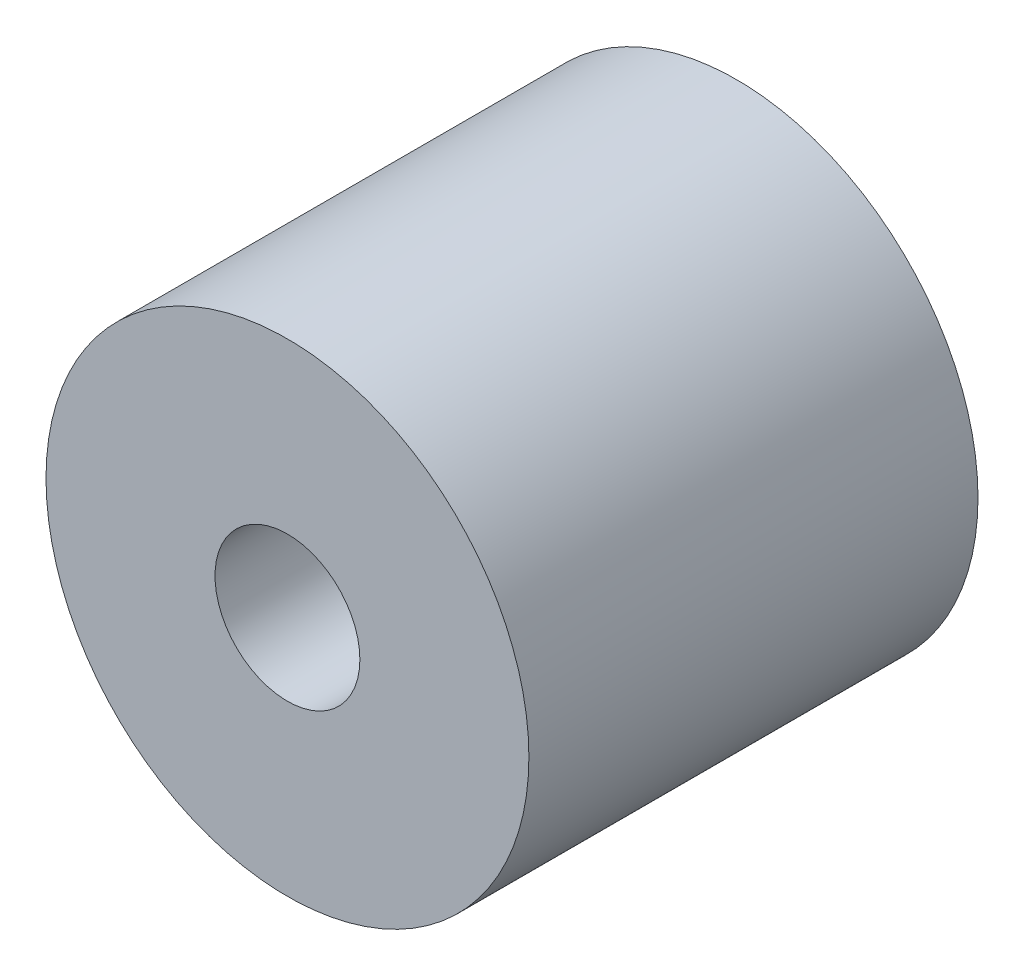
ISO-10303-21;
HEADER;
FILE_DESCRIPTION(('STEP AP214'),'2;1');
FILE_NAME('part.step','',(''),(''),'','','');
FILE_SCHEMA(('AUTOMOTIVE_DESIGN { 1 0 10303 214 1 1 1 1 }'));
ENDSEC;
DATA;
#1=APPLICATION_CONTEXT('core data for automotive mechanical design processes');
#2=APPLICATION_PROTOCOL_DEFINITION('international standard','automotive_design',2000,#1);
#3=PRODUCT_CONTEXT('',#1,'mechanical');
#4=PRODUCT('Part','Part','',(#3));
#5=PRODUCT_RELATED_PRODUCT_CATEGORY('part','',(#4));
#6=PRODUCT_DEFINITION_FORMATION('','',#4);
#7=PRODUCT_DEFINITION_CONTEXT('part definition',#1,'design');
#8=PRODUCT_DEFINITION('design','',#6,#7);
#9=PRODUCT_DEFINITION_SHAPE('','',#8);
#10=(LENGTH_UNIT() NAMED_UNIT(*) SI_UNIT(.MILLI.,.METRE.));
#11=(NAMED_UNIT(*) PLANE_ANGLE_UNIT() SI_UNIT($,.RADIAN.));
#12=(NAMED_UNIT(*) SI_UNIT($,.STERADIAN.) SOLID_ANGLE_UNIT());
#13=UNCERTAINTY_MEASURE_WITH_UNIT(LENGTH_MEASURE(1.E-05),#10,'distance_accuracy_value','');
#14=(GEOMETRIC_REPRESENTATION_CONTEXT(3) GLOBAL_UNCERTAINTY_ASSIGNED_CONTEXT((#13)) GLOBAL_UNIT_ASSIGNED_CONTEXT((#10,
#11,#12)) REPRESENTATION_CONTEXT('',''));
#15=CARTESIAN_POINT('',(0.,0.,0.));
#16=DIRECTION('',(0.,0.,1.));
#17=DIRECTION('',(1.,0.,0.));
#18=AXIS2_PLACEMENT_3D('',#15,#16,#17);
#19=CARTESIAN_POINT('',(0.,0.,9.3));
#20=DIRECTION('',(0.,0.,-1.));
#21=DIRECTION('',(-1.,0.,0.));
#22=AXIS2_PLACEMENT_3D('',#19,#20,#21);
#23=CYLINDRICAL_SURFACE('',#22,5.);
#24=CARTESIAN_POINT('',(0.,-5.,2.5));
#25=CARTESIAN_POINT('',(0.0280101768957786,-4.99999967760385,2.49999878704981));
#26=CARTESIAN_POINT('',(0.0560388725838865,-4.99976212798103,2.49763836555178));
#27=CARTESIAN_POINT('',(0.111319199248419,-4.99883733797369,2.48825781485479));
#28=CARTESIAN_POINT('',(0.138569939584414,-4.99814960217013,2.48123255198771));
#29=CARTESIAN_POINT('',(0.191485837726708,-4.99640207281535,2.46272887970108));
#30=CARTESIAN_POINT('',(0.217151942307455,-4.99534250400354,2.45125315974076));
#31=CARTESIAN_POINT('',(0.266188080480204,-4.99296978697153,2.42417954603418));
#32=CARTESIAN_POINT('',(0.289558569389539,-4.99165668919066,2.40858247199993));
#33=CARTESIAN_POINT('',(0.333429775337041,-4.98891872170662,2.37364865116886));
#34=CARTESIAN_POINT('',(0.353921072417446,-4.98749350786933,2.35430010029898));
#35=CARTESIAN_POINT('',(0.391371260715492,-4.98469478453131,2.31243773286849));
#36=CARTESIAN_POINT('',(0.408329988541327,-4.98332127742458,2.28992376997881));
#37=CARTESIAN_POINT('',(0.438266985221809,-4.98077795776392,2.24231073415819));
#38=CARTESIAN_POINT('',(0.45123673272744,-4.97960858355452,2.21720627795257));
#39=CARTESIAN_POINT('',(0.47277319237138,-4.97761018773262,2.16516220704751));
#40=CARTESIAN_POINT('',(0.481340013295646,-4.97678115771111,2.13822263770803));
#41=CARTESIAN_POINT('',(0.493799520800947,-4.97556042036489,2.08336909956699));
#42=CARTESIAN_POINT('',(0.497707826501898,-4.97516725199048,2.0554587115739));
#43=CARTESIAN_POINT('',(0.50078764256768,-4.97485821530263,1.99937556830211));
#44=CARTESIAN_POINT('',(0.499959277435401,-4.97494233444373,1.97120281993897));
#45=CARTESIAN_POINT('',(0.493602140126339,-4.97557703449467,1.91550234515334));
#46=CARTESIAN_POINT('',(0.488090422062276,-4.97612592295325,1.88797265033565));
#47=CARTESIAN_POINT('',(0.472549572075293,-4.97762567143709,1.83423101839945));
#48=CARTESIAN_POINT('',(0.462520379127873,-4.97857653689246,1.80801909908748));
#49=CARTESIAN_POINT('',(0.438210446940754,-4.98077504726035,1.75760320635056));
#50=CARTESIAN_POINT('',(0.42392214135999,-4.98202321954079,1.73340290525534));
#51=CARTESIAN_POINT('',(0.391505013676614,-4.98467525866439,1.68773739254406));
#52=CARTESIAN_POINT('',(0.373376079168253,-4.98607913006392,1.66627226100912));
#53=CARTESIAN_POINT('',(0.333697056206035,-4.98889192656495,1.62658730300549));
#54=CARTESIAN_POINT('',(0.312132239425682,-4.99030084666499,1.6083821990596));
#55=CARTESIAN_POINT('',(0.266244740868556,-4.99295914539259,1.57584818354481));
#56=CARTESIAN_POINT('',(0.2419220559998,-4.99420852384128,1.56151927632176));
#57=CARTESIAN_POINT('',(0.191199052846182,-4.99640737833548,1.53714498984487));
#58=CARTESIAN_POINT('',(0.164798373194951,-4.99735680207385,1.52710035759097));
#59=CARTESIAN_POINT('',(0.110673608664966,-4.99884823720704,1.51159054164412));
#60=CARTESIAN_POINT('',(0.0829495633883001,-4.99939026078532,1.50612522100469));
#61=CARTESIAN_POINT('',(0.0270925495459519,-5.00000425834155,1.49994784613262));
#62=CARTESIAN_POINT('',(-0.00103815105274598,-5.00007824133868,1.49921547587375));
#63=CARTESIAN_POINT('',(-0.0570218966578499,-4.99975320878398,1.50247143152438));
#64=CARTESIAN_POINT('',(-0.084874945410235,-4.99935419962234,1.50645969365764));
#65=CARTESIAN_POINT('',(-0.139454103417338,-4.99812930769597,1.51902684771079));
#66=CARTESIAN_POINT('',(-0.16618242448601,-4.9973043095902,1.52759622723901));
#67=CARTESIAN_POINT('',(-0.217822160691891,-4.99531999430305,1.54907258701864));
#68=CARTESIAN_POINT('',(-0.242733535078559,-4.99416066962627,1.5619796645197));
#69=CARTESIAN_POINT('',(-0.290124090086071,-4.99163237665211,1.59181541933196));
#70=CARTESIAN_POINT('',(-0.312594829874459,-4.9902627180172,1.60875744446291));
#71=CARTESIAN_POINT('',(-0.354380811655939,-4.9874696643476,1.64616303387046));
#72=CARTESIAN_POINT('',(-0.373695974424589,-4.98604626796486,1.66662668653516));
#73=CARTESIAN_POINT('',(-0.408693054943573,-4.98330012070377,1.7105832873295));
#74=CARTESIAN_POINT('',(-0.424361639339772,-4.98197775069488,1.73408687827131));
#75=CARTESIAN_POINT('',(-0.451529129371914,-4.97958916230445,1.78340368007334));
#76=CARTESIAN_POINT('',(-0.463028092026941,-4.97852294042019,1.8092168593442));
#77=CARTESIAN_POINT('',(-0.481507604342238,-4.97676973817025,1.8623743697329));
#78=CARTESIAN_POINT('',(-0.488496087405931,-4.97608209224894,1.88971592004556));
#79=CARTESIAN_POINT('',(-0.497782003564732,-4.97516182641438,1.94519159898039));
#80=CARTESIAN_POINT('',(-0.500079571199759,-4.97492919345093,1.97332570484784));
#81=CARTESIAN_POINT('',(-0.499916569235628,-4.97494556553781,2.02945534417835));
#82=CARTESIAN_POINT('',(-0.497476944796556,-4.97519245043504,2.05745094144141));
#83=CARTESIAN_POINT('',(-0.487952726481827,-4.97613551944773,2.11263245858414));
#84=CARTESIAN_POINT('',(-0.48086812738108,-4.97683170406859,2.13981837755299));
#85=CARTESIAN_POINT('',(-0.462260843148752,-4.97859434131593,2.19260867452393));
#86=CARTESIAN_POINT('',(-0.450738772170458,-4.9796607427018,2.21821327081486));
#87=CARTESIAN_POINT('',(-0.423585777455522,-4.98204375919679,2.26712844583552));
#88=CARTESIAN_POINT('',(-0.407954876727707,-4.98336037290475,2.29043903741032));
#89=CARTESIAN_POINT('',(-0.372949278142666,-4.98610243604849,2.33421183723597));
#90=CARTESIAN_POINT('',(-0.353558974445134,-4.98752832363375,2.35466153818354));
#91=CARTESIAN_POINT('',(-0.311615849612555,-4.99032427364391,2.39202611634983));
#92=CARTESIAN_POINT('',(-0.289062272054128,-4.99169432261488,2.40894014567859));
#93=CARTESIAN_POINT('',(-0.241370717080645,-4.99422781034581,2.43878672692731));
#94=CARTESIAN_POINT('',(-0.216226374673382,-4.99539072013406,2.45170914547259));
#95=CARTESIAN_POINT('',(-0.164129139550275,-4.99737314624948,2.47313121141193));
#96=CARTESIAN_POINT('',(-0.137178324912805,-4.99819304954827,2.48163584547677));
#97=CARTESIAN_POINT('',(-0.0917291307028519,-4.99919106886867,2.4918603085424));
#98=CARTESIAN_POINT('',(-0.0735212764222541,-4.99949300345916,2.49490852214968));
#99=CARTESIAN_POINT('',(-0.0368782904086562,-4.99989757475393,2.49897876303088));
#100=CARTESIAN_POINT('',(-0.0184431596132788,-5.00000021228012,2.50000079866093));
#101=CARTESIAN_POINT('',(0.,-5.,2.5));
#102=B_SPLINE_CURVE_WITH_KNOTS('',3,(#24,#25,#26,#27,#28,#29,#30,#31,#32,#33,#34,#35,#36,#37,
#38,#39,#40,#41,#42,#43,#44,#45,#46,#47,#48,#49,#50,#51,#52,#53,#54,#55,#56,#57,#58,#59,#60,#61,
#62,#63,#64,#65,#66,#67,#68,#69,#70,#71,#72,#73,#74,#75,#76,#77,#78,#79,#80,#81,#82,#83,#84,#85,
#86,#87,#88,#89,#90,#91,#92,#93,#94,#95,#96,#97,#98,#99,#100,#101),.UNSPECIFIED.,.T.,.F.,(4,2,2,
2,2,2,2,2,2,2,2,2,2,2,2,2,2,2,2,2,2,2,2,2,2,2,2,2,2,2,2,2,2,2,2,2,2,2,4),(0.,0.083963183134237,
0.168018921417743,0.252023942866102,0.336012268791392,0.420269284311473,0.504530196103529,
0.588969877361109,0.67340747221252,0.757561160225983,0.841712636278883,0.925558987205553,
1.00940647080817,1.09340380686447,1.17740360165563,1.26177367098103,1.34614383489886,
1.43052870346791,1.5149110483772,1.59893094303879,1.68294970259572,1.76679467647152,
1.85064153024734,1.93476970374349,2.01889998905115,2.10333321804299,2.18776529237687,
2.27204845296502,2.35632919619793,2.44023814646978,2.5241471911302,2.608044626814,
2.6919415926948,2.77619458713827,2.86046776318479,2.94495315513121,3.02934297397648,
3.08462833616174,3.13991347034514),.UNSPECIFIED.);
#103=CARTESIAN_POINT('',(0.,-5.,2.5));
#104=VERTEX_POINT('',#103);
#105=EDGE_CURVE('E69',#104,#104,#102,.T.);
#106=ORIENTED_EDGE('',*,*,#105,.T.);
#107=EDGE_LOOP('',(#106));
#108=FACE_BOUND('',#107,.T.);
#109=CARTESIAN_POINT('',(0.,0.,9.3));
#110=DIRECTION('',(0.,0.,1.));
#111=DIRECTION('',(1.,0.,0.));
#112=AXIS2_PLACEMENT_3D('',#109,#110,#111);
#113=CIRCLE('',#112,5.);
#114=CARTESIAN_POINT('',(5.,0.,9.3));
#115=VERTEX_POINT('',#114);
#116=EDGE_CURVE('E11',#115,#115,#113,.T.);
#117=ORIENTED_EDGE('',*,*,#116,.F.);
#118=EDGE_LOOP('',(#117));
#119=FACE_BOUND('',#118,.T.);
#120=CARTESIAN_POINT('',(0.,0.,0.));
#121=DIRECTION('',(0.,0.,1.));
#122=DIRECTION('',(1.,0.,0.));
#123=AXIS2_PLACEMENT_3D('',#120,#121,#122);
#124=CIRCLE('',#123,5.);
#125=CARTESIAN_POINT('',(5.,0.,0.));
#126=VERTEX_POINT('',#125);
#127=EDGE_CURVE('E53',#126,#126,#124,.T.);
#128=ORIENTED_EDGE('',*,*,#127,.T.);
#129=EDGE_LOOP('',(#128));
#130=FACE_BOUND('',#129,.T.);
#131=ADVANCED_FACE('F39',(#108,#119,#130),#23,.T.);
#132=CARTESIAN_POINT('',(0.,0.,9.3));
#133=DIRECTION('',(0.,0.,1.));
#134=DIRECTION('',(1.,0.,0.));
#135=AXIS2_PLACEMENT_3D('',#132,#133,#134);
#136=PLANE('',#135);
#137=CARTESIAN_POINT('',(0.,0.,9.3));
#138=DIRECTION('',(0.,0.,1.));
#139=DIRECTION('',(1.,0.,0.));
#140=AXIS2_PLACEMENT_3D('',#137,#138,#139);
#141=CIRCLE('',#140,1.5);
#142=CARTESIAN_POINT('',(1.5,0.,9.3));
#143=VERTEX_POINT('',#142);
#144=EDGE_CURVE('E84',#143,#143,#141,.T.);
#145=ORIENTED_EDGE('',*,*,#144,.F.);
#146=EDGE_LOOP('',(#145));
#147=FACE_BOUND('',#146,.T.);
#148=ORIENTED_EDGE('',*,*,#116,.T.);
#149=EDGE_LOOP('',(#148));
#150=FACE_BOUND('',#149,.T.);
#151=ADVANCED_FACE('F108',(#147,#150),#136,.T.);
#152=CARTESIAN_POINT('',(0.,0.,0.));
#153=DIRECTION('',(0.,0.,1.));
#154=DIRECTION('',(1.,0.,0.));
#155=AXIS2_PLACEMENT_3D('',#152,#153,#154);
#156=PLANE('',#155);
#157=CARTESIAN_POINT('',(0.,0.,0.));
#158=DIRECTION('',(0.,0.,1.));
#159=DIRECTION('',(1.,0.,0.));
#160=AXIS2_PLACEMENT_3D('',#157,#158,#159);
#161=CIRCLE('',#160,1.5);
#162=CARTESIAN_POINT('',(1.5,0.,0.));
#163=VERTEX_POINT('',#162);
#164=EDGE_CURVE('E74',#163,#163,#161,.T.);
#165=ORIENTED_EDGE('',*,*,#164,.T.);
#166=EDGE_LOOP('',(#165));
#167=FACE_BOUND('',#166,.T.);
#168=ORIENTED_EDGE('',*,*,#127,.F.);
#169=EDGE_LOOP('',(#168));
#170=FACE_BOUND('',#169,.T.);
#171=ADVANCED_FACE('F113',(#167,#170),#156,.F.);
#172=CARTESIAN_POINT('',(0.,0.,0.));
#173=DIRECTION('',(0.,0.,1.));
#174=DIRECTION('',(1.,0.,0.));
#175=AXIS2_PLACEMENT_3D('',#172,#173,#174);
#176=CYLINDRICAL_SURFACE('',#175,1.5);
#177=CARTESIAN_POINT('',(0.,-1.5,2.5));
#178=CARTESIAN_POINT('',(-0.0272816814433617,-1.50000007650472,2.50000012686582));
#179=CARTESIAN_POINT('',(-0.0545625972692751,-1.49924884753774,2.49775986693639));
#180=CARTESIAN_POINT('',(-0.108320880436486,-1.49632605101639,2.48888544559139));
#181=CARTESIAN_POINT('',(-0.134798164059409,-1.49415433601069,2.48225082802554));
#182=CARTESIAN_POINT('',(-0.186166394750889,-1.48862653953228,2.46484037830797));
#183=CARTESIAN_POINT('',(-0.211059912943019,-1.48527243865453,2.45407146877035));
#184=CARTESIAN_POINT('',(-0.258687468402661,-1.47772222858644,2.42872941358084));
#185=CARTESIAN_POINT('',(-0.281421078479347,-1.47352595333789,2.41415551749874));
#186=CARTESIAN_POINT('',(-0.32487083751114,-1.46457047221606,2.38108709757058));
#187=CARTESIAN_POINT('',(-0.34550185014918,-1.45979778232283,2.36248438286959));
#188=CARTESIAN_POINT('',(-0.383416346351018,-1.45030157391171,2.32211642264688));
#189=CARTESIAN_POINT('',(-0.40069909274464,-1.44557806643817,2.30035048253637));
#190=CARTESIAN_POINT('',(-0.431912471114024,-1.43656666240137,2.25350744240113));
#191=CARTESIAN_POINT('',(-0.445732429110874,-1.43229519643517,2.22835313013151));
#192=CARTESIAN_POINT('',(-0.468909436938504,-1.42487652703629,2.17591195277315));
#193=CARTESIAN_POINT('',(-0.478267848692049,-1.4217289805919,2.1486257414277));
#194=CARTESIAN_POINT('',(-0.491936730754163,-1.41705651655216,2.09366338924975));
#195=CARTESIAN_POINT('',(-0.496406724138347,-1.41548047960085,2.06603139573733));
#196=CARTESIAN_POINT('',(-0.500670561669923,-1.41397828389571,2.0103681229003));
#197=CARTESIAN_POINT('',(-0.500465850802425,-1.41405161531,1.98233696963626));
#198=CARTESIAN_POINT('',(-0.495509951851011,-1.41579507485375,1.92803168477975));
#199=CARTESIAN_POINT('',(-0.49096695658331,-1.41739207928749,1.90173579854096));
#200=CARTESIAN_POINT('',(-0.477803081424896,-1.42188328867294,1.85030329019611));
#201=CARTESIAN_POINT('',(-0.469181713295986,-1.42477764893409,1.82516680728234));
#202=CARTESIAN_POINT('',(-0.447969529030054,-1.43158955564248,1.77629362520439));
#203=CARTESIAN_POINT('',(-0.435317024353618,-1.43552282896189,1.75258598726527));
#204=CARTESIAN_POINT('',(-0.406444553151583,-1.44396279288233,1.7075645458601));
#205=CARTESIAN_POINT('',(-0.390223556182006,-1.44846964895333,1.6862514365333));
#206=CARTESIAN_POINT('',(-0.353674666341114,-1.45783664583764,1.64545420091962));
#207=CARTESIAN_POINT('',(-0.333176575038154,-1.46270294677393,1.62612365274547));
#208=CARTESIAN_POINT('',(-0.289169784985033,-1.47203469193547,1.5911343666683));
#209=CARTESIAN_POINT('',(-0.265660797830407,-1.47650009769041,1.57547598091775));
#210=CARTESIAN_POINT('',(-0.215973806523134,-1.48458553968889,1.54815184988247));
#211=CARTESIAN_POINT('',(-0.189771638208168,-1.48819675004018,1.53652725432963));
#212=CARTESIAN_POINT('',(-0.135634541682254,-1.49410283572219,1.51789841302214));
#213=CARTESIAN_POINT('',(-0.107700219077477,-1.4963981682744,1.51089256228828));
#214=CARTESIAN_POINT('',(-0.0521919147646515,-1.4993381353572,1.50197216698882));
#215=CARTESIAN_POINT('',(-0.0246547999324223,-1.50005000916865,1.49985009541363));
#216=CARTESIAN_POINT('',(0.0303875349801186,-1.49994451347413,1.50016633679923));
#217=CARTESIAN_POINT('',(0.0578927596598238,-1.49912740209676,1.50260387998993));
#218=CARTESIAN_POINT('',(0.11125993315213,-1.49610012358557,1.51180595386798));
#219=CARTESIAN_POINT('',(0.137146403417428,-1.49393099355614,1.51844310302476));
#220=CARTESIAN_POINT('',(0.187427979289781,-1.48845923415017,1.53569672223335));
#221=CARTESIAN_POINT('',(0.21182289425428,-1.48515646023271,1.54631369973384));
#222=CARTESIAN_POINT('',(0.259144148196661,-1.47764465643714,1.57153521592045));
#223=CARTESIAN_POINT('',(0.282014979608665,-1.47341407378153,1.5862372966418));
#224=CARTESIAN_POINT('',(0.325032415067702,-1.46452626957872,1.61909707500653));
#225=CARTESIAN_POINT('',(0.345178183897447,-1.45986891795944,1.63725582801508));
#226=CARTESIAN_POINT('',(0.383126253903507,-1.45038423991236,1.67748937550413));
#227=CARTESIAN_POINT('',(0.400780484624246,-1.44555880547578,1.69970461346662));
#228=CARTESIAN_POINT('',(0.432128761160427,-1.43649986643491,1.74688578390225));
#229=CARTESIAN_POINT('',(0.445822773960422,-1.4322663667656,1.7718517393051));
#230=CARTESIAN_POINT('',(0.468798465211681,-1.42491195910154,1.8238365076533));
#231=CARTESIAN_POINT('',(0.478089066098883,-1.42178880450316,1.85085103962139));
#232=CARTESIAN_POINT('',(0.491947333396082,-1.41705416199567,1.90618932506208));
#233=CARTESIAN_POINT('',(0.496517127480622,-1.41544199311349,1.93451248271653));
#234=CARTESIAN_POINT('',(0.50063814123519,-1.41398929437536,1.99009854800661));
#235=CARTESIAN_POINT('',(0.500435128655464,-1.4140620017215,2.01734117012587));
#236=CARTESIAN_POINT('',(0.495621146727439,-1.4157563496178,2.07138253744987));
#237=CARTESIAN_POINT('',(0.491010439729444,-1.41737789797942,2.09818130897646));
#238=CARTESIAN_POINT('',(0.47768590656349,-1.42192262139472,2.15006783150633));
#239=CARTESIAN_POINT('',(0.46905167300744,-1.42482049007757,2.17517841250362));
#240=CARTESIAN_POINT('',(0.447989682880191,-1.43158199412717,2.22361370346777));
#241=CARTESIAN_POINT('',(0.43556108427699,-1.43544584382648,2.24693801559363));
#242=CARTESIAN_POINT('',(0.406630346291624,-1.4439141461203,2.29224183496185));
#243=CARTESIAN_POINT('',(0.389974121382266,-1.44854355820802,2.3141182509493));
#244=CARTESIAN_POINT('',(0.353321441567849,-1.45791678141893,2.354844906692));
#245=CARTESIAN_POINT('',(0.333324042225747,-1.46266062456259,2.37369428784401));
#246=CARTESIAN_POINT('',(0.289620778460337,-1.47195015262697,2.40857220614462));
#247=CARTESIAN_POINT('',(0.265800756749862,-1.47648090900608,2.42446217387551));
#248=CARTESIAN_POINT('',(0.215678678703314,-1.48462995586326,2.45199521442532));
#249=CARTESIAN_POINT('',(0.189377259066175,-1.4882484795397,2.46363937296102));
#250=CARTESIAN_POINT('',(0.136246823600487,-1.49402757534266,2.48186081624434));
#251=CARTESIAN_POINT('',(0.109493878838204,-1.4962460621126,2.48864123313169));
#252=CARTESIAN_POINT('',(0.0551602080051237,-1.49923203532112,2.49771014033856));
#253=CARTESIAN_POINT('',(0.0275797127843733,-1.49999992265952,2.49999987174827));
#254=CARTESIAN_POINT('',(0.,-1.5,2.5));
#255=B_SPLINE_CURVE_WITH_KNOTS('',3,(#177,#178,#179,#180,#181,#182,#183,#184,#185,#186,#187,
#188,#189,#190,#191,#192,#193,#194,#195,#196,#197,#198,#199,#200,#201,#202,#203,#204,#205,#206,
#207,#208,#209,#210,#211,#212,#213,#214,#215,#216,#217,#218,#219,#220,#221,#222,#223,#224,#225,
#226,#227,#228,#229,#230,#231,#232,#233,#234,#235,#236,#237,#238,#239,#240,#241,#242,#243,#244,
#245,#246,#247,#248,#249,#250,#251,#252,#253,#254),.UNSPECIFIED.,.T.,.F.,(4,2,2,2,2,2,2,2,2,2,2,
2,2,2,2,2,2,2,2,2,2,2,2,2,2,2,2,2,2,2,2,2,2,2,2,2,2,2,4),(0.,0.0817435530130055,
0.163495592633761,0.245111336435137,0.32674318889955,0.41092342141378,0.495122166437652,
0.581741924117352,0.668335223464167,0.752009628687921,0.835658169894179,0.915484132713153,
0.995319654234162,1.07644085573241,1.15758551274779,1.24296652901359,1.32835572978984,
1.41459202820854,1.50079834434279,1.5832679158326,1.66572356577764,1.74579078984782,
1.82586822637727,1.90805199917544,1.99026090406621,2.07620511436051,2.16215004113174,
2.24792006907883,2.33365142346098,2.41497833023985,2.49630039666268,2.57607793530789,
2.65587319078569,2.73915033336483,2.8224510555247,2.9089983040813,2.99552340566808,
3.07818279177487,3.1608193300965),.UNSPECIFIED.);
#256=CARTESIAN_POINT('',(0.,-1.5,2.5));
#257=VERTEX_POINT('',#256);
#258=EDGE_CURVE('E43',#257,#257,#255,.T.);
#259=ORIENTED_EDGE('',*,*,#258,.T.);
#260=EDGE_LOOP('',(#259));
#261=FACE_BOUND('',#260,.T.);
#262=CARTESIAN_POINT('',(0.,1.5,1.50000000000001));
#263=CARTESIAN_POINT('',(-0.0272816814433614,1.50000007650472,1.49999987313419));
#264=CARTESIAN_POINT('',(-0.0545625972692745,1.49924884753774,1.50224013306361));
#265=CARTESIAN_POINT('',(-0.108320880436485,1.49632605101639,1.51111455440861));
#266=CARTESIAN_POINT('',(-0.134798164059407,1.49415433601069,1.51774917197446));
#267=CARTESIAN_POINT('',(-0.186166394750887,1.48862653953229,1.53515962169203));
#268=CARTESIAN_POINT('',(-0.211059912943017,1.48527243865453,1.54592853122965));
#269=CARTESIAN_POINT('',(-0.258687468402658,1.47772222858644,1.57127058641917));
#270=CARTESIAN_POINT('',(-0.281421078479344,1.47352595333789,1.58584448250126));
#271=CARTESIAN_POINT('',(-0.324870837511136,1.46457047221606,1.61891290242942));
#272=CARTESIAN_POINT('',(-0.345501850149176,1.45979778232283,1.63751561713042));
#273=CARTESIAN_POINT('',(-0.383416346351013,1.45030157391171,1.67788357735312));
#274=CARTESIAN_POINT('',(-0.400699092744635,1.44557806643817,1.69964951746364));
#275=CARTESIAN_POINT('',(-0.431912471114019,1.43656666240137,1.74649255759887));
#276=CARTESIAN_POINT('',(-0.445732429110868,1.43229519643517,1.77164686986849));
#277=CARTESIAN_POINT('',(-0.468909436938499,1.42487652703629,1.82408804722685));
#278=CARTESIAN_POINT('',(-0.478267848692043,1.4217289805919,1.85137425857231));
#279=CARTESIAN_POINT('',(-0.491936730754157,1.41705651655216,1.90633661075025));
#280=CARTESIAN_POINT('',(-0.496406724138342,1.41548047960086,1.93396860426267));
#281=CARTESIAN_POINT('',(-0.500670561669918,1.41397828389571,1.9896318770997));
#282=CARTESIAN_POINT('',(-0.50046585080242,1.41405161531,2.01766303036374));
#283=CARTESIAN_POINT('',(-0.495509951851006,1.41579507485375,2.07196831522025));
#284=CARTESIAN_POINT('',(-0.490966956583305,1.41739207928749,2.09826420145904));
#285=CARTESIAN_POINT('',(-0.477803081424891,1.42188328867294,2.14969670980389));
#286=CARTESIAN_POINT('',(-0.469181713295981,1.42477764893409,2.17483319271766));
#287=CARTESIAN_POINT('',(-0.447969529030049,1.43158955564248,2.22370637479561));
#288=CARTESIAN_POINT('',(-0.435317024353613,1.43552282896189,2.24741401273473));
#289=CARTESIAN_POINT('',(-0.406444553151579,1.44396279288233,2.2924354541399));
#290=CARTESIAN_POINT('',(-0.390223556182002,1.44846964895333,2.3137485634667));
#291=CARTESIAN_POINT('',(-0.353674666341111,1.45783664583764,2.35454579908037));
#292=CARTESIAN_POINT('',(-0.333176575038151,1.46270294677393,2.37387634725453));
#293=CARTESIAN_POINT('',(-0.289169784985029,1.47203469193547,2.4088656333317));
#294=CARTESIAN_POINT('',(-0.265660797830404,1.47650009769041,2.42452401908224));
#295=CARTESIAN_POINT('',(-0.215973806523131,1.48458553968889,2.45184815011753));
#296=CARTESIAN_POINT('',(-0.189771638208165,1.48819675004018,2.46347274567036));
#297=CARTESIAN_POINT('',(-0.135634541682252,1.49410283572219,2.48210158697785));
#298=CARTESIAN_POINT('',(-0.107700219077475,1.4963981682744,2.48910743771171));
#299=CARTESIAN_POINT('',(-0.0521919147646508,1.4993381353572,2.49802783301117));
#300=CARTESIAN_POINT('',(-0.0246547999324218,1.50005000916865,2.50014990458637));
#301=CARTESIAN_POINT('',(0.0303875349801184,1.49994451347413,2.49983366320076));
#302=CARTESIAN_POINT('',(0.0578927596598234,1.49912740209676,2.49739612001006));
#303=CARTESIAN_POINT('',(0.111259933152129,1.49610012358557,2.48819404613201));
#304=CARTESIAN_POINT('',(0.137146403417427,1.49393099355614,2.48155689697523));
#305=CARTESIAN_POINT('',(0.187427979289779,1.48845923415017,2.46430327776665));
#306=CARTESIAN_POINT('',(0.211822894254278,1.48515646023271,2.45368630026616));
#307=CARTESIAN_POINT('',(0.259144148196659,1.47764465643714,2.42846478407954));
#308=CARTESIAN_POINT('',(0.282014979608662,1.47341407378153,2.4137627033582));
#309=CARTESIAN_POINT('',(0.325032415067699,1.46452626957872,2.38090292499347));
#310=CARTESIAN_POINT('',(0.345178183897444,1.45986891795944,2.36274417198491));
#311=CARTESIAN_POINT('',(0.383126253903503,1.45038423991236,2.32251062449586));
#312=CARTESIAN_POINT('',(0.400780484624242,1.44555880547578,2.30029538653337));
#313=CARTESIAN_POINT('',(0.432128761160423,1.43649986643491,2.25311421609775));
#314=CARTESIAN_POINT('',(0.445822773960417,1.4322663667656,2.2281482606949));
#315=CARTESIAN_POINT('',(0.468798465211676,1.42491195910154,2.1761634923467));
#316=CARTESIAN_POINT('',(0.478089066098878,1.42178880450316,2.14914896037861));
#317=CARTESIAN_POINT('',(0.491947333396076,1.41705416199567,2.09381067493792));
#318=CARTESIAN_POINT('',(0.496517127480616,1.41544199311349,2.06548751728347));
#319=CARTESIAN_POINT('',(0.500638141235184,1.41398929437536,2.00990145199339));
#320=CARTESIAN_POINT('',(0.500435128655458,1.4140620017215,1.98265882987413));
#321=CARTESIAN_POINT('',(0.495621146727433,1.4157563496178,1.92861746255013));
#322=CARTESIAN_POINT('',(0.491010439729438,1.41737789797942,1.90181869102354));
#323=CARTESIAN_POINT('',(0.477685906563485,1.42192262139472,1.84993216849367));
#324=CARTESIAN_POINT('',(0.469051673007434,1.42482049007757,1.82482158749638));
#325=CARTESIAN_POINT('',(0.447989682880186,1.43158199412717,1.77638629653224));
#326=CARTESIAN_POINT('',(0.435561084276984,1.43544584382648,1.75306198440637));
#327=CARTESIAN_POINT('',(0.406630346291619,1.4439141461203,1.70775816503816));
#328=CARTESIAN_POINT('',(0.389974121382261,1.44854355820802,1.6858817490507));
#329=CARTESIAN_POINT('',(0.353321441567844,1.45791678141893,1.64515509330801));
#330=CARTESIAN_POINT('',(0.333324042225743,1.46266062456259,1.62630571215599));
#331=CARTESIAN_POINT('',(0.289620778460333,1.47195015262697,1.59142779385538));
#332=CARTESIAN_POINT('',(0.265800756749859,1.47648090900608,1.5755378261245));
#333=CARTESIAN_POINT('',(0.215678678703311,1.48462995586326,1.54800478557469));
#334=CARTESIAN_POINT('',(0.189377259066172,1.4882484795397,1.53636062703899));
#335=CARTESIAN_POINT('',(0.136246823600485,1.49402757534266,1.51813918375567));
#336=CARTESIAN_POINT('',(0.109493878838202,1.4962460621126,1.51135876686832));
#337=CARTESIAN_POINT('',(0.0551602080051225,1.49923203532112,1.50228985966144));
#338=CARTESIAN_POINT('',(0.0275797127843727,1.49999992265952,1.50000012825174));
#339=CARTESIAN_POINT('',(0.,1.5,1.50000000000001));
#340=B_SPLINE_CURVE_WITH_KNOTS('',3,(#262,#263,#264,#265,#266,#267,#268,#269,#270,#271,#272,
#273,#274,#275,#276,#277,#278,#279,#280,#281,#282,#283,#284,#285,#286,#287,#288,#289,#290,#291,
#292,#293,#294,#295,#296,#297,#298,#299,#300,#301,#302,#303,#304,#305,#306,#307,#308,#309,#310,
#311,#312,#313,#314,#315,#316,#317,#318,#319,#320,#321,#322,#323,#324,#325,#326,#327,#328,#329,
#330,#331,#332,#333,#334,#335,#336,#337,#338,#339),.UNSPECIFIED.,.T.,.F.,(4,2,2,2,2,2,2,2,2,2,2,
2,2,2,2,2,2,2,2,2,2,2,2,2,2,2,2,2,2,2,2,2,2,2,2,2,2,2,4),(0.,0.0817435530130046,
0.163495592633759,0.245111336435134,0.326743188899547,0.410923421413776,0.495122166437646,
0.581741924117346,0.668335223464159,0.752009628687913,0.835658169894169,0.915484132713143,
0.995319654234151,1.07644085573239,1.15758551274777,1.24296652901357,1.32835572978983,
1.41459202820852,1.50079834434278,1.58326791583258,1.66572356577762,1.7457907898478,
1.82586822637725,1.90805199917541,1.99026090406619,2.07620511436049,2.16215004113171,
2.24792006907881,2.33365142346095,2.41497833023982,2.49630039666265,2.57607793530786,
2.65587319078566,2.7391503333648,2.82245105552466,2.90899830408127,2.99552340566805,
3.07818279177484,3.16081933009646),.UNSPECIFIED.);
#341=CARTESIAN_POINT('',(0.,1.5,1.50000000000001));
#342=VERTEX_POINT('',#341);
#343=EDGE_CURVE('E68',#342,#342,#340,.T.);
#344=ORIENTED_EDGE('',*,*,#343,.T.);
#345=EDGE_LOOP('',(#344));
#346=FACE_BOUND('',#345,.T.);
#347=ORIENTED_EDGE('',*,*,#144,.T.);
#348=EDGE_LOOP('',(#347));
#349=FACE_BOUND('',#348,.T.);
#350=ORIENTED_EDGE('',*,*,#164,.F.);
#351=EDGE_LOOP('',(#350));
#352=FACE_BOUND('',#351,.T.);
#353=ADVANCED_FACE('F94',(#261,#346,#349,#352),#176,.F.);
#354=CARTESIAN_POINT('',(0.,0.,2.));
#355=DIRECTION('',(0.,-1.,0.));
#356=DIRECTION('',(0.,0.,-1.));
#357=AXIS2_PLACEMENT_3D('',#354,#355,#356);
#358=CYLINDRICAL_SURFACE('',#357,0.499999999999995);
#359=CARTESIAN_POINT('',(0.,4.,2.));
#360=DIRECTION('',(0.,-1.,0.));
#361=DIRECTION('',(0.,0.,-1.));
#362=AXIS2_PLACEMENT_3D('',#359,#360,#361);
#363=CIRCLE('',#362,0.499999999999999);
#364=CARTESIAN_POINT('',(0.,4.,1.5));
#365=VERTEX_POINT('',#364);
#366=EDGE_CURVE('E65',#365,#365,#363,.T.);
#367=ORIENTED_EDGE('',*,*,#366,.F.);
#368=EDGE_LOOP('',(#367));
#369=FACE_BOUND('',#368,.T.);
#370=ORIENTED_EDGE('',*,*,#343,.F.);
#371=EDGE_LOOP('',(#370));
#372=FACE_BOUND('',#371,.T.);
#373=ADVANCED_FACE('F61',(#369,#372),#358,.F.);
#374=CARTESIAN_POINT('',(0.,4.,2.));
#375=DIRECTION('',(0.,-1.,0.));
#376=DIRECTION('',(0.,0.,-1.));
#377=AXIS2_PLACEMENT_3D('',#374,#375,#376);
#378=CONICAL_SURFACE('',#377,0.499999999999999,1.02974425867665);
#379=CARTESIAN_POINT('',(0.,4.30043030951378,2.));
#380=VERTEX_POINT('',#379);
#381=VERTEX_LOOP('',#380);
#382=FACE_BOUND('',#381,.T.);
#383=ORIENTED_EDGE('',*,*,#366,.T.);
#384=EDGE_LOOP('',(#383));
#385=FACE_BOUND('',#384,.T.);
#386=ADVANCED_FACE('F57',(#382,#385),#378,.F.);
#387=CARTESIAN_POINT('',(0.,-10.,2.));
#388=DIRECTION('',(0.,1.,0.));
#389=DIRECTION('',(0.,0.,1.));
#390=AXIS2_PLACEMENT_3D('',#387,#388,#389);
#391=CYLINDRICAL_SURFACE('',#390,0.5);
#392=ORIENTED_EDGE('',*,*,#258,.F.);
#393=EDGE_LOOP('',(#392));
#394=FACE_BOUND('',#393,.T.);
#395=ORIENTED_EDGE('',*,*,#105,.F.);
#396=EDGE_LOOP('',(#395));
#397=FACE_BOUND('',#396,.T.);
#398=ADVANCED_FACE('F60',(#394,#397),#391,.F.);
#399=CLOSED_SHELL('',(#131,#151,#171,#353,#373,#386,#398));
#400=MANIFOLD_SOLID_BREP('B2',#399);
#401=ADVANCED_BREP_SHAPE_REPRESENTATION('',(#18,#400),#14);
#402=SHAPE_DEFINITION_REPRESENTATION(#9,#401);
ENDSEC;
END-ISO-10303-21;
